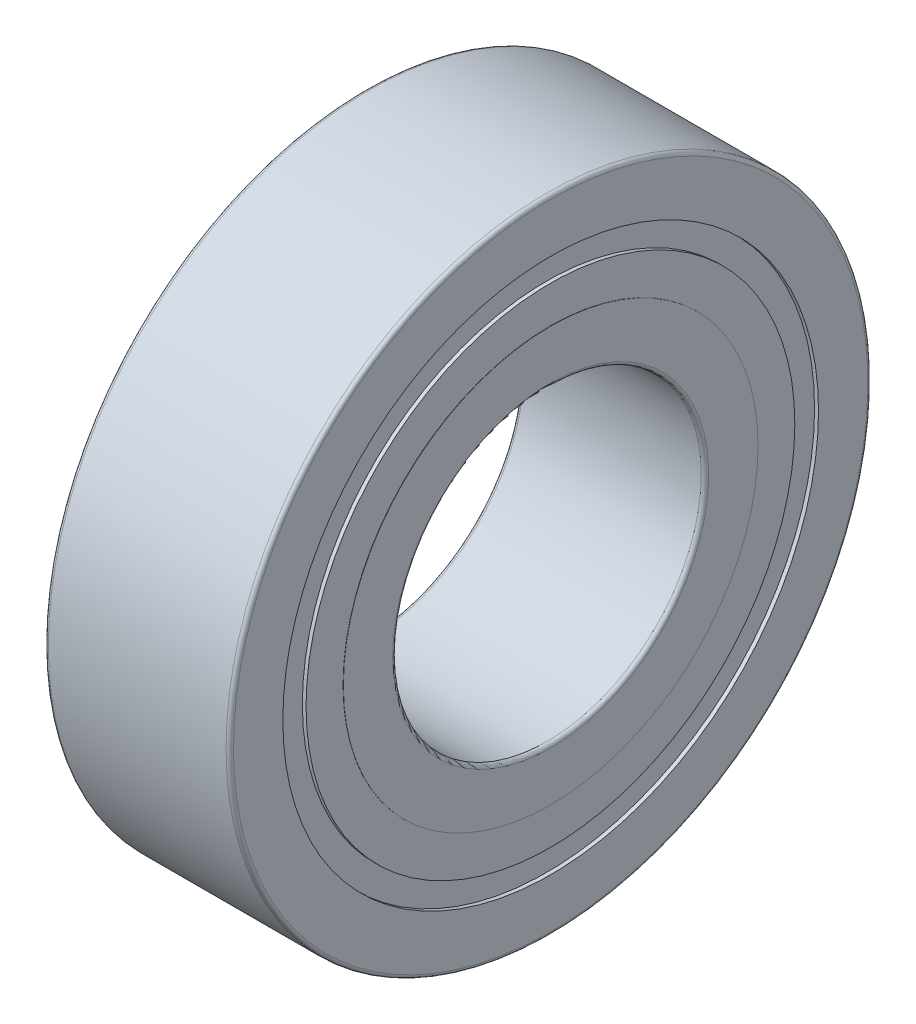
ISO-10303-21;
HEADER;
FILE_DESCRIPTION(('STEP AP214'),'2;1');
FILE_NAME('part.step','',(''),(''),'','','');
FILE_SCHEMA(('AUTOMOTIVE_DESIGN { 1 0 10303 214 1 1 1 1 }'));
ENDSEC;
DATA;
#1=APPLICATION_CONTEXT('core data for automotive mechanical design processes');
#2=APPLICATION_PROTOCOL_DEFINITION('international standard','automotive_design',2000,#1);
#3=PRODUCT_CONTEXT('',#1,'mechanical');
#4=PRODUCT('Part','Part','',(#3));
#5=PRODUCT_RELATED_PRODUCT_CATEGORY('part','',(#4));
#6=PRODUCT_DEFINITION_FORMATION('','',#4);
#7=PRODUCT_DEFINITION_CONTEXT('part definition',#1,'design');
#8=PRODUCT_DEFINITION('design','',#6,#7);
#9=PRODUCT_DEFINITION_SHAPE('','',#8);
#10=(LENGTH_UNIT() NAMED_UNIT(*) SI_UNIT(.MILLI.,.METRE.));
#11=(NAMED_UNIT(*) PLANE_ANGLE_UNIT() SI_UNIT($,.RADIAN.));
#12=(NAMED_UNIT(*) SI_UNIT($,.STERADIAN.) SOLID_ANGLE_UNIT());
#13=UNCERTAINTY_MEASURE_WITH_UNIT(LENGTH_MEASURE(1.E-05),#10,'distance_accuracy_value','');
#14=(GEOMETRIC_REPRESENTATION_CONTEXT(3) GLOBAL_UNCERTAINTY_ASSIGNED_CONTEXT((#13)) GLOBAL_UNIT_ASSIGNED_CONTEXT((#10,
#11,#12)) REPRESENTATION_CONTEXT('',''));
#15=CARTESIAN_POINT('',(0.,0.,0.));
#16=DIRECTION('',(0.,0.,1.));
#17=DIRECTION('',(1.,0.,0.));
#18=AXIS2_PLACEMENT_3D('',#15,#16,#17);
#19=CARTESIAN_POINT('',(7.5,12.8,0.));
#20=DIRECTION('',(-1.,0.,0.));
#21=DIRECTION('',(0.,0.,1.));
#22=AXIS2_PLACEMENT_3D('',#19,#20,#21);
#23=PLANE('',#22);
#24=CARTESIAN_POINT('',(7.5,0.,0.));
#25=DIRECTION('',(-1.,0.,0.));
#26=DIRECTION('',(0.,0.,1.));
#27=AXIS2_PLACEMENT_3D('',#24,#25,#26);
#28=CIRCLE('',#27,12.8);
#29=CARTESIAN_POINT('',(7.5,0.,12.8));
#30=VERTEX_POINT('',#29);
#31=EDGE_CURVE('E45',#30,#30,#28,.T.);
#32=ORIENTED_EDGE('',*,*,#31,.T.);
#33=EDGE_LOOP('',(#32));
#34=FACE_BOUND('',#33,.T.);
#35=CARTESIAN_POINT('',(7.5,0.,0.));
#36=DIRECTION('',(-1.,0.,0.));
#37=DIRECTION('',(0.,0.,1.));
#38=AXIS2_PLACEMENT_3D('',#35,#36,#37);
#39=CIRCLE('',#38,16.8);
#40=CARTESIAN_POINT('',(7.5,0.,16.8));
#41=VERTEX_POINT('',#40);
#42=EDGE_CURVE('E192',#41,#41,#39,.T.);
#43=ORIENTED_EDGE('',*,*,#42,.F.);
#44=EDGE_LOOP('',(#43));
#45=FACE_BOUND('',#44,.T.);
#46=ADVANCED_FACE('F32',(#34,#45),#23,.F.);
#47=CARTESIAN_POINT('',(7.5,0.,0.));
#48=DIRECTION('',(-1.,0.,0.));
#49=DIRECTION('',(0.,0.,1.));
#50=AXIS2_PLACEMENT_3D('',#47,#48,#49);
#51=CIRCLE('',#50,25.7);
#52=CARTESIAN_POINT('',(7.5,0.,25.7));
#53=VERTEX_POINT('',#52);
#54=EDGE_CURVE('E75',#53,#53,#51,.T.);
#55=ORIENTED_EDGE('',*,*,#54,.F.);
#56=EDGE_LOOP('',(#55));
#57=FACE_BOUND('',#56,.T.);
#58=CARTESIAN_POINT('',(7.5,0.,0.));
#59=DIRECTION('',(-1.,0.,0.));
#60=DIRECTION('',(0.,0.,1.));
#61=AXIS2_PLACEMENT_3D('',#58,#59,#60);
#62=CIRCLE('',#61,21.7);
#63=CARTESIAN_POINT('',(7.5,0.,21.7));
#64=VERTEX_POINT('',#63);
#65=EDGE_CURVE('E36',#64,#64,#62,.F.);
#66=ORIENTED_EDGE('',*,*,#65,.F.);
#67=EDGE_LOOP('',(#66));
#68=FACE_BOUND('',#67,.T.);
#69=ADVANCED_FACE('F97',(#57,#68),#23,.F.);
#70=CARTESIAN_POINT('',(-7.5,25.7,0.));
#71=DIRECTION('',(1.,0.,0.));
#72=DIRECTION('',(0.,0.,-1.));
#73=AXIS2_PLACEMENT_3D('',#70,#71,#72);
#74=PLANE('',#73);
#75=CARTESIAN_POINT('',(-7.5,0.,0.));
#76=DIRECTION('',(-1.,0.,0.));
#77=DIRECTION('',(0.,0.,1.));
#78=AXIS2_PLACEMENT_3D('',#75,#76,#77);
#79=CIRCLE('',#78,25.7);
#80=CARTESIAN_POINT('',(-7.5,0.,25.7));
#81=VERTEX_POINT('',#80);
#82=EDGE_CURVE('E55',#81,#81,#79,.T.);
#83=ORIENTED_EDGE('',*,*,#82,.T.);
#84=EDGE_LOOP('',(#83));
#85=FACE_BOUND('',#84,.T.);
#86=CARTESIAN_POINT('',(-7.5,0.,0.));
#87=DIRECTION('',(1.,0.,0.));
#88=DIRECTION('',(0.,0.,-1.));
#89=AXIS2_PLACEMENT_3D('',#86,#87,#88);
#90=CIRCLE('',#89,21.7);
#91=CARTESIAN_POINT('',(-7.5,0.,-21.7));
#92=VERTEX_POINT('',#91);
#93=EDGE_CURVE('E48',#92,#92,#90,.F.);
#94=ORIENTED_EDGE('',*,*,#93,.F.);
#95=EDGE_LOOP('',(#94));
#96=FACE_BOUND('',#95,.T.);
#97=ADVANCED_FACE('F102',(#85,#96),#74,.F.);
#98=CARTESIAN_POINT('',(-7.5,0.,0.));
#99=DIRECTION('',(-1.,0.,0.));
#100=DIRECTION('',(0.,0.,1.));
#101=AXIS2_PLACEMENT_3D('',#98,#99,#100);
#102=CIRCLE('',#101,12.8);
#103=CARTESIAN_POINT('',(-7.5,0.,12.8));
#104=VERTEX_POINT('',#103);
#105=EDGE_CURVE('E50',#104,#104,#102,.T.);
#106=ORIENTED_EDGE('',*,*,#105,.F.);
#107=EDGE_LOOP('',(#106));
#108=FACE_BOUND('',#107,.T.);
#109=CARTESIAN_POINT('',(-7.5,0.,0.));
#110=DIRECTION('',(-1.,0.,0.));
#111=DIRECTION('',(0.,0.,1.));
#112=AXIS2_PLACEMENT_3D('',#109,#110,#111);
#113=CIRCLE('',#112,16.8);
#114=CARTESIAN_POINT('',(-7.5,0.,16.8));
#115=VERTEX_POINT('',#114);
#116=EDGE_CURVE('E51',#115,#115,#113,.T.);
#117=ORIENTED_EDGE('',*,*,#116,.T.);
#118=EDGE_LOOP('',(#117));
#119=FACE_BOUND('',#118,.T.);
#120=ADVANCED_FACE('F94',(#108,#119),#74,.F.);
#121=CARTESIAN_POINT('',(-7.20000000000012,0.,0.));
#122=DIRECTION('',(-1.,0.,0.));
#123=DIRECTION('',(0.,0.,1.));
#124=AXIS2_PLACEMENT_3D('',#121,#122,#123);
#125=TOROIDAL_SURFACE('',#124,12.7999999999999,0.299999999999875);
#126=CARTESIAN_POINT('',(-7.2,0.,0.));
#127=DIRECTION('',(-1.,0.,0.));
#128=DIRECTION('',(0.,0.,1.));
#129=AXIS2_PLACEMENT_3D('',#126,#127,#128);
#130=CIRCLE('',#129,12.5);
#131=CARTESIAN_POINT('',(-7.2,0.,12.5));
#132=VERTEX_POINT('',#131);
#133=EDGE_CURVE('E10',#132,#132,#130,.T.);
#134=ORIENTED_EDGE('',*,*,#133,.F.);
#135=EDGE_LOOP('',(#134));
#136=FACE_BOUND('',#135,.T.);
#137=ORIENTED_EDGE('',*,*,#105,.T.);
#138=EDGE_LOOP('',(#137));
#139=FACE_BOUND('',#138,.T.);
#140=ADVANCED_FACE('F34',(#136,#139),#125,.T.);
#141=CARTESIAN_POINT('',(50.,0.,0.));
#142=DIRECTION('',(-1.,0.,0.));
#143=DIRECTION('',(0.,0.,1.));
#144=AXIS2_PLACEMENT_3D('',#141,#142,#143);
#145=CYLINDRICAL_SURFACE('',#144,12.5);
#146=CARTESIAN_POINT('',(7.2,0.,0.));
#147=DIRECTION('',(-1.,0.,0.));
#148=DIRECTION('',(0.,0.,1.));
#149=AXIS2_PLACEMENT_3D('',#146,#147,#148);
#150=CIRCLE('',#149,12.5);
#151=CARTESIAN_POINT('',(7.2,0.,12.5));
#152=VERTEX_POINT('',#151);
#153=EDGE_CURVE('E40',#152,#152,#150,.T.);
#154=ORIENTED_EDGE('',*,*,#153,.F.);
#155=EDGE_LOOP('',(#154));
#156=FACE_BOUND('',#155,.T.);
#157=ORIENTED_EDGE('',*,*,#133,.T.);
#158=EDGE_LOOP('',(#157));
#159=FACE_BOUND('',#158,.T.);
#160=ADVANCED_FACE('F86',(#156,#159),#145,.F.);
#161=CARTESIAN_POINT('',(7.20000000000012,0.,0.));
#162=DIRECTION('',(-1.,0.,0.));
#163=DIRECTION('',(0.,0.,1.));
#164=AXIS2_PLACEMENT_3D('',#161,#162,#163);
#165=TOROIDAL_SURFACE('',#164,12.7999999999999,0.299999999999875);
#166=ORIENTED_EDGE('',*,*,#31,.F.);
#167=EDGE_LOOP('',(#166));
#168=FACE_BOUND('',#167,.T.);
#169=ORIENTED_EDGE('',*,*,#153,.T.);
#170=EDGE_LOOP('',(#169));
#171=FACE_BOUND('',#170,.T.);
#172=ADVANCED_FACE('F82',(#168,#171),#165,.T.);
#173=CARTESIAN_POINT('',(7.20000000000013,0.,0.));
#174=DIRECTION('',(-1.,0.,0.));
#175=DIRECTION('',(0.,0.,1.));
#176=AXIS2_PLACEMENT_3D('',#173,#174,#175);
#177=TOROIDAL_SURFACE('',#176,25.7000000000001,0.299999999999873);
#178=CARTESIAN_POINT('',(7.2,0.,0.));
#179=DIRECTION('',(-1.,0.,0.));
#180=DIRECTION('',(0.,0.,1.));
#181=AXIS2_PLACEMENT_3D('',#178,#179,#180);
#182=CIRCLE('',#181,26.);
#183=CARTESIAN_POINT('',(7.2,0.,26.));
#184=VERTEX_POINT('',#183);
#185=EDGE_CURVE('E72',#184,#184,#182,.T.);
#186=ORIENTED_EDGE('',*,*,#185,.F.);
#187=EDGE_LOOP('',(#186));
#188=FACE_BOUND('',#187,.T.);
#189=ORIENTED_EDGE('',*,*,#54,.T.);
#190=EDGE_LOOP('',(#189));
#191=FACE_BOUND('',#190,.T.);
#192=ADVANCED_FACE('F85',(#188,#191),#177,.T.);
#193=CARTESIAN_POINT('',(50.,0.,0.));
#194=DIRECTION('',(-1.,0.,0.));
#195=DIRECTION('',(0.,0.,1.));
#196=AXIS2_PLACEMENT_3D('',#193,#194,#195);
#197=CYLINDRICAL_SURFACE('',#196,26.);
#198=CARTESIAN_POINT('',(-7.2,0.,0.));
#199=DIRECTION('',(-1.,0.,0.));
#200=DIRECTION('',(0.,0.,1.));
#201=AXIS2_PLACEMENT_3D('',#198,#199,#200);
#202=CIRCLE('',#201,26.);
#203=CARTESIAN_POINT('',(-7.2,0.,26.));
#204=VERTEX_POINT('',#203);
#205=EDGE_CURVE('E69',#204,#204,#202,.T.);
#206=ORIENTED_EDGE('',*,*,#205,.F.);
#207=EDGE_LOOP('',(#206));
#208=FACE_BOUND('',#207,.T.);
#209=ORIENTED_EDGE('',*,*,#185,.T.);
#210=EDGE_LOOP('',(#209));
#211=FACE_BOUND('',#210,.T.);
#212=ADVANCED_FACE('F107',(#208,#211),#197,.T.);
#213=CARTESIAN_POINT('',(-7.20000000000013,0.,0.));
#214=DIRECTION('',(-1.,0.,0.));
#215=DIRECTION('',(0.,0.,1.));
#216=AXIS2_PLACEMENT_3D('',#213,#214,#215);
#217=TOROIDAL_SURFACE('',#216,25.7000000000001,0.299999999999873);
#218=ORIENTED_EDGE('',*,*,#82,.F.);
#219=EDGE_LOOP('',(#218));
#220=FACE_BOUND('',#219,.T.);
#221=ORIENTED_EDGE('',*,*,#205,.T.);
#222=EDGE_LOOP('',(#221));
#223=FACE_BOUND('',#222,.T.);
#224=ADVANCED_FACE('F111',(#220,#223),#217,.T.);
#225=CARTESIAN_POINT('',(50.,0.,0.));
#226=DIRECTION('',(-1.,0.,0.));
#227=DIRECTION('',(0.,0.,1.));
#228=AXIS2_PLACEMENT_3D('',#225,#226,#227);
#229=CYLINDRICAL_SURFACE('',#228,21.7);
#230=CARTESIAN_POINT('',(-7.18,0.,0.));
#231=DIRECTION('',(-1.,0.,0.));
#232=DIRECTION('',(0.,0.,1.));
#233=AXIS2_PLACEMENT_3D('',#230,#231,#232);
#234=CIRCLE('',#233,21.7);
#235=CARTESIAN_POINT('',(-7.18,0.,21.7));
#236=VERTEX_POINT('',#235);
#237=EDGE_CURVE('E167',#236,#236,#234,.T.);
#238=ORIENTED_EDGE('',*,*,#237,.F.);
#239=EDGE_LOOP('',(#238));
#240=FACE_BOUND('',#239,.T.);
#241=ORIENTED_EDGE('',*,*,#93,.T.);
#242=EDGE_LOOP('',(#241));
#243=FACE_BOUND('',#242,.T.);
#244=ADVANCED_FACE('F115',(#240,#243),#229,.F.);
#245=CARTESIAN_POINT('',(50.,0.,0.));
#246=DIRECTION('',(-1.,0.,0.));
#247=DIRECTION('',(0.,0.,1.));
#248=AXIS2_PLACEMENT_3D('',#245,#246,#247);
#249=CYLINDRICAL_SURFACE('',#248,16.8);
#250=CARTESIAN_POINT('',(-7.48,0.,0.));
#251=DIRECTION('',(-1.,0.,0.));
#252=DIRECTION('',(0.,0.,1.));
#253=AXIS2_PLACEMENT_3D('',#250,#251,#252);
#254=CIRCLE('',#253,16.8);
#255=CARTESIAN_POINT('',(-7.48,0.,16.8));
#256=VERTEX_POINT('',#255);
#257=EDGE_CURVE('E58',#256,#256,#254,.T.);
#258=ORIENTED_EDGE('',*,*,#257,.T.);
#259=EDGE_LOOP('',(#258));
#260=FACE_BOUND('',#259,.T.);
#261=ORIENTED_EDGE('',*,*,#116,.F.);
#262=EDGE_LOOP('',(#261));
#263=FACE_BOUND('',#262,.T.);
#264=ADVANCED_FACE('F122',(#260,#263),#249,.T.);
#265=CARTESIAN_POINT('',(-7.48,16.8,0.));
#266=DIRECTION('',(-1.,0.,0.));
#267=DIRECTION('',(0.,0.,1.));
#268=AXIS2_PLACEMENT_3D('',#265,#266,#267);
#269=PLANE('',#268);
#270=CARTESIAN_POINT('',(-7.48,0.,0.));
#271=DIRECTION('',(-1.,0.,0.));
#272=DIRECTION('',(0.,0.,1.));
#273=AXIS2_PLACEMENT_3D('',#270,#271,#272);
#274=CIRCLE('',#273,19.8);
#275=CARTESIAN_POINT('',(-7.48,0.,19.8));
#276=VERTEX_POINT('',#275);
#277=EDGE_CURVE('E63',#276,#276,#274,.T.);
#278=ORIENTED_EDGE('',*,*,#277,.T.);
#279=EDGE_LOOP('',(#278));
#280=FACE_BOUND('',#279,.T.);
#281=ORIENTED_EDGE('',*,*,#257,.F.);
#282=EDGE_LOOP('',(#281));
#283=FACE_BOUND('',#282,.T.);
#284=ADVANCED_FACE('F126',(#280,#283),#269,.T.);
#285=CARTESIAN_POINT('',(50.,0.,0.));
#286=DIRECTION('',(-1.,0.,0.));
#287=DIRECTION('',(0.,0.,1.));
#288=AXIS2_PLACEMENT_3D('',#285,#286,#287);
#289=CYLINDRICAL_SURFACE('',#288,19.8);
#290=CARTESIAN_POINT('',(-7.18,0.,0.));
#291=DIRECTION('',(-1.,0.,0.));
#292=DIRECTION('',(0.,0.,1.));
#293=AXIS2_PLACEMENT_3D('',#290,#291,#292);
#294=CIRCLE('',#293,19.8);
#295=CARTESIAN_POINT('',(-7.18,0.,19.8));
#296=VERTEX_POINT('',#295);
#297=EDGE_CURVE('E170',#296,#296,#294,.T.);
#298=ORIENTED_EDGE('',*,*,#297,.T.);
#299=EDGE_LOOP('',(#298));
#300=FACE_BOUND('',#299,.T.);
#301=ORIENTED_EDGE('',*,*,#277,.F.);
#302=EDGE_LOOP('',(#301));
#303=FACE_BOUND('',#302,.T.);
#304=ADVANCED_FACE('F130',(#300,#303),#289,.T.);
#305=CARTESIAN_POINT('',(-7.18,19.8,0.));
#306=DIRECTION('',(-1.,0.,0.));
#307=DIRECTION('',(0.,0.,1.));
#308=AXIS2_PLACEMENT_3D('',#305,#306,#307);
#309=PLANE('',#308);
#310=ORIENTED_EDGE('',*,*,#237,.T.);
#311=EDGE_LOOP('',(#310));
#312=FACE_BOUND('',#311,.T.);
#313=ORIENTED_EDGE('',*,*,#297,.F.);
#314=EDGE_LOOP('',(#313));
#315=FACE_BOUND('',#314,.T.);
#316=ADVANCED_FACE('F134',(#312,#315),#309,.T.);
#317=CARTESIAN_POINT('',(50.,0.,0.));
#318=DIRECTION('',(-1.,0.,0.));
#319=DIRECTION('',(0.,0.,1.));
#320=AXIS2_PLACEMENT_3D('',#317,#318,#319);
#321=CYLINDRICAL_SURFACE('',#320,21.7);
#322=CARTESIAN_POINT('',(7.18,0.,0.));
#323=DIRECTION('',(-1.,0.,0.));
#324=DIRECTION('',(0.,0.,1.));
#325=AXIS2_PLACEMENT_3D('',#322,#323,#324);
#326=CIRCLE('',#325,21.7);
#327=CARTESIAN_POINT('',(7.18,0.,21.7));
#328=VERTEX_POINT('',#327);
#329=EDGE_CURVE('E163',#328,#328,#326,.T.);
#330=ORIENTED_EDGE('',*,*,#329,.T.);
#331=EDGE_LOOP('',(#330));
#332=FACE_BOUND('',#331,.T.);
#333=ORIENTED_EDGE('',*,*,#65,.T.);
#334=EDGE_LOOP('',(#333));
#335=FACE_BOUND('',#334,.T.);
#336=ADVANCED_FACE('F138',(#332,#335),#321,.F.);
#337=CARTESIAN_POINT('',(7.18,21.7,0.));
#338=DIRECTION('',(1.,0.,0.));
#339=DIRECTION('',(0.,0.,-1.));
#340=AXIS2_PLACEMENT_3D('',#337,#338,#339);
#341=PLANE('',#340);
#342=CARTESIAN_POINT('',(7.18,0.,0.));
#343=DIRECTION('',(-1.,0.,0.));
#344=DIRECTION('',(0.,0.,1.));
#345=AXIS2_PLACEMENT_3D('',#342,#343,#344);
#346=CIRCLE('',#345,19.8);
#347=CARTESIAN_POINT('',(7.18,0.,19.8));
#348=VERTEX_POINT('',#347);
#349=EDGE_CURVE('E168',#348,#348,#346,.T.);
#350=ORIENTED_EDGE('',*,*,#349,.T.);
#351=EDGE_LOOP('',(#350));
#352=FACE_BOUND('',#351,.T.);
#353=ORIENTED_EDGE('',*,*,#329,.F.);
#354=EDGE_LOOP('',(#353));
#355=FACE_BOUND('',#354,.T.);
#356=ADVANCED_FACE('F140',(#352,#355),#341,.T.);
#357=CARTESIAN_POINT('',(50.,0.,0.));
#358=DIRECTION('',(-1.,0.,0.));
#359=DIRECTION('',(0.,0.,1.));
#360=AXIS2_PLACEMENT_3D('',#357,#358,#359);
#361=CYLINDRICAL_SURFACE('',#360,19.8);
#362=CARTESIAN_POINT('',(7.48,0.,0.));
#363=DIRECTION('',(-1.,0.,0.));
#364=DIRECTION('',(0.,0.,1.));
#365=AXIS2_PLACEMENT_3D('',#362,#363,#364);
#366=CIRCLE('',#365,19.8);
#367=CARTESIAN_POINT('',(7.48,0.,19.8));
#368=VERTEX_POINT('',#367);
#369=EDGE_CURVE('E173',#368,#368,#366,.T.);
#370=ORIENTED_EDGE('',*,*,#369,.T.);
#371=EDGE_LOOP('',(#370));
#372=FACE_BOUND('',#371,.T.);
#373=ORIENTED_EDGE('',*,*,#349,.F.);
#374=EDGE_LOOP('',(#373));
#375=FACE_BOUND('',#374,.T.);
#376=ADVANCED_FACE('F143',(#372,#375),#361,.T.);
#377=CARTESIAN_POINT('',(7.48,19.8,0.));
#378=DIRECTION('',(1.,0.,0.));
#379=DIRECTION('',(0.,0.,-1.));
#380=AXIS2_PLACEMENT_3D('',#377,#378,#379);
#381=PLANE('',#380);
#382=CARTESIAN_POINT('',(7.48,0.,0.));
#383=DIRECTION('',(-1.,0.,0.));
#384=DIRECTION('',(0.,0.,1.));
#385=AXIS2_PLACEMENT_3D('',#382,#383,#384);
#386=CIRCLE('',#385,16.8);
#387=CARTESIAN_POINT('',(7.48,0.,16.8));
#388=VERTEX_POINT('',#387);
#389=EDGE_CURVE('E177',#388,#388,#386,.T.);
#390=ORIENTED_EDGE('',*,*,#389,.T.);
#391=EDGE_LOOP('',(#390));
#392=FACE_BOUND('',#391,.T.);
#393=ORIENTED_EDGE('',*,*,#369,.F.);
#394=EDGE_LOOP('',(#393));
#395=FACE_BOUND('',#394,.T.);
#396=ADVANCED_FACE('F147',(#392,#395),#381,.T.);
#397=CARTESIAN_POINT('',(50.,0.,0.));
#398=DIRECTION('',(-1.,0.,0.));
#399=DIRECTION('',(0.,0.,1.));
#400=AXIS2_PLACEMENT_3D('',#397,#398,#399);
#401=CYLINDRICAL_SURFACE('',#400,16.8);
#402=ORIENTED_EDGE('',*,*,#42,.T.);
#403=EDGE_LOOP('',(#402));
#404=FACE_BOUND('',#403,.T.);
#405=ORIENTED_EDGE('',*,*,#389,.F.);
#406=EDGE_LOOP('',(#405));
#407=FACE_BOUND('',#406,.T.);
#408=ADVANCED_FACE('F151',(#404,#407),#401,.T.);
#409=CLOSED_SHELL('',(#46,#69,#97,#120,#140,#160,#172,#192,#212,#224,#244,#264,#284,#304,#316,
#336,#356,#376,#396,#408));
#410=MANIFOLD_SOLID_BREP('B2',#409);
#411=ADVANCED_BREP_SHAPE_REPRESENTATION('',(#18,#410),#14);
#412=SHAPE_DEFINITION_REPRESENTATION(#9,#411);
ENDSEC;
END-ISO-10303-21;
